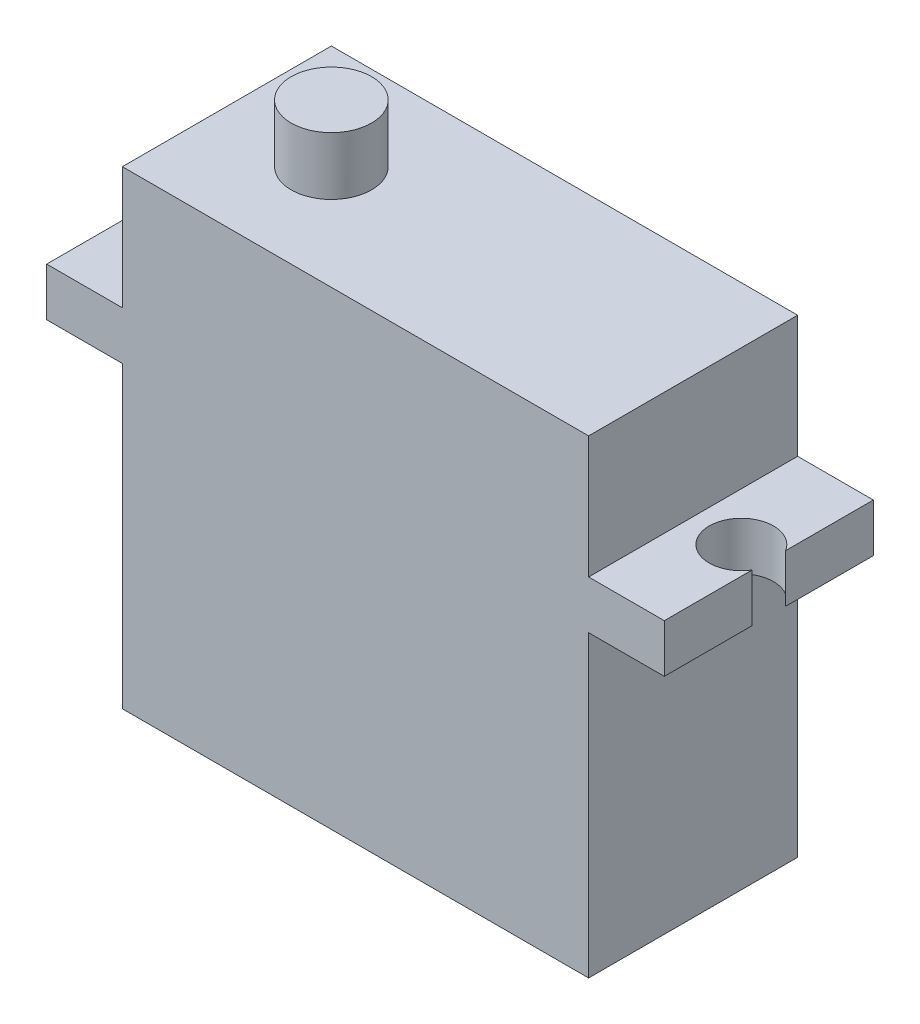
ISO-10303-21;
HEADER;
FILE_DESCRIPTION(('STEP AP214'),'2;1');
FILE_NAME('part.step','',(''),(''),'','','');
FILE_SCHEMA(('AUTOMOTIVE_DESIGN { 1 0 10303 214 1 1 1 1 }'));
ENDSEC;
DATA;
#1=APPLICATION_CONTEXT('core data for automotive mechanical design processes');
#2=APPLICATION_PROTOCOL_DEFINITION('international standard','automotive_design',2000,#1);
#3=PRODUCT_CONTEXT('',#1,'mechanical');
#4=PRODUCT('Part','Part','',(#3));
#5=PRODUCT_RELATED_PRODUCT_CATEGORY('part','',(#4));
#6=PRODUCT_DEFINITION_FORMATION('','',#4);
#7=PRODUCT_DEFINITION_CONTEXT('part definition',#1,'design');
#8=PRODUCT_DEFINITION('design','',#6,#7);
#9=PRODUCT_DEFINITION_SHAPE('','',#8);
#10=(LENGTH_UNIT() NAMED_UNIT(*) SI_UNIT(.MILLI.,.METRE.));
#11=(NAMED_UNIT(*) PLANE_ANGLE_UNIT() SI_UNIT($,.RADIAN.));
#12=(NAMED_UNIT(*) SI_UNIT($,.STERADIAN.) SOLID_ANGLE_UNIT());
#13=UNCERTAINTY_MEASURE_WITH_UNIT(LENGTH_MEASURE(1.E-05),#10,'distance_accuracy_value','');
#14=(GEOMETRIC_REPRESENTATION_CONTEXT(3) GLOBAL_UNCERTAINTY_ASSIGNED_CONTEXT((#13)) GLOBAL_UNIT_ASSIGNED_CONTEXT((#10,
#11,#12)) REPRESENTATION_CONTEXT('',''));
#15=CARTESIAN_POINT('',(0.,0.,0.));
#16=DIRECTION('',(0.,0.,1.));
#17=DIRECTION('',(1.,0.,0.));
#18=AXIS2_PLACEMENT_3D('',#15,#16,#17);
#19=CARTESIAN_POINT('',(29.,29.2,0.));
#20=DIRECTION('',(-1.,0.,0.));
#21=DIRECTION('',(0.,0.,1.));
#22=AXIS2_PLACEMENT_3D('',#19,#20,#21);
#23=PLANE('',#22);
#24=DIRECTION('',(0.,0.,1.));
#25=VECTOR('',#24,1.);
#26=CARTESIAN_POINT('',(29.,21.6,0.));
#27=LINE('',#26,#25);
#28=CARTESIAN_POINT('',(29.,21.6,-13.));
#29=VERTEX_POINT('',#28);
#30=CARTESIAN_POINT('',(29.,21.6,0.));
#31=VERTEX_POINT('',#30);
#32=EDGE_CURVE('E193',#29,#31,#27,.T.);
#33=ORIENTED_EDGE('',*,*,#32,.F.);
#34=DIRECTION('',(0.,-1.,0.));
#35=VECTOR('',#34,1.);
#36=CARTESIAN_POINT('',(29.,29.2,-13.));
#37=LINE('',#36,#35);
#38=CARTESIAN_POINT('',(29.,29.2,-13.));
#39=VERTEX_POINT('',#38);
#40=EDGE_CURVE('E314',#39,#29,#37,.T.);
#41=ORIENTED_EDGE('',*,*,#40,.F.);
#42=DIRECTION('',(0.,0.,-1.));
#43=VECTOR('',#42,1.);
#44=CARTESIAN_POINT('',(29.,29.2,0.));
#45=LINE('',#44,#43);
#46=CARTESIAN_POINT('',(29.,29.2,0.));
#47=VERTEX_POINT('',#46);
#48=EDGE_CURVE('E291',#47,#39,#45,.T.);
#49=ORIENTED_EDGE('',*,*,#48,.F.);
#50=DIRECTION('',(0.,-1.,0.));
#51=VECTOR('',#50,1.);
#52=CARTESIAN_POINT('',(29.,29.2,0.));
#53=LINE('',#52,#51);
#54=EDGE_CURVE('E318',#47,#31,#53,.T.);
#55=ORIENTED_EDGE('',*,*,#54,.T.);
#56=EDGE_LOOP('',(#33,#41,#49,#55));
#57=FACE_BOUND('',#56,.T.);
#58=ADVANCED_FACE('F49',(#57),#23,.F.);
#59=CARTESIAN_POINT('',(0.,29.2,0.));
#60=DIRECTION('',(1.,0.,0.));
#61=DIRECTION('',(0.,0.,-1.));
#62=AXIS2_PLACEMENT_3D('',#59,#60,#61);
#63=PLANE('',#62);
#64=DIRECTION('',(0.,0.,-1.));
#65=VECTOR('',#64,1.);
#66=CARTESIAN_POINT('',(0.,21.6,0.));
#67=LINE('',#66,#65);
#68=CARTESIAN_POINT('',(0.,21.6,0.));
#69=VERTEX_POINT('',#68);
#70=CARTESIAN_POINT('',(0.,21.6,-13.));
#71=VERTEX_POINT('',#70);
#72=EDGE_CURVE('E243',#69,#71,#67,.T.);
#73=ORIENTED_EDGE('',*,*,#72,.F.);
#74=DIRECTION('',(0.,-1.,0.));
#75=VECTOR('',#74,1.);
#76=CARTESIAN_POINT('',(0.,29.2,0.));
#77=LINE('',#76,#75);
#78=CARTESIAN_POINT('',(0.,29.2,0.));
#79=VERTEX_POINT('',#78);
#80=EDGE_CURVE('E58',#79,#69,#77,.T.);
#81=ORIENTED_EDGE('',*,*,#80,.F.);
#82=DIRECTION('',(0.,0.,1.));
#83=VECTOR('',#82,1.);
#84=CARTESIAN_POINT('',(0.,29.2,0.));
#85=LINE('',#84,#83);
#86=CARTESIAN_POINT('',(0.,29.2,-13.));
#87=VERTEX_POINT('',#86);
#88=EDGE_CURVE('E283',#87,#79,#85,.T.);
#89=ORIENTED_EDGE('',*,*,#88,.F.);
#90=DIRECTION('',(0.,-1.,0.));
#91=VECTOR('',#90,1.);
#92=CARTESIAN_POINT('',(0.,29.2,-13.));
#93=LINE('',#92,#91);
#94=EDGE_CURVE('E311',#87,#71,#93,.T.);
#95=ORIENTED_EDGE('',*,*,#94,.T.);
#96=EDGE_LOOP('',(#73,#81,#89,#95));
#97=FACE_BOUND('',#96,.T.);
#98=ADVANCED_FACE('F370',(#97),#63,.F.);
#99=CARTESIAN_POINT('',(0.,18.6,0.));
#100=VERTEX_POINT('',#99);
#101=CARTESIAN_POINT('',(0.,0.,0.));
#102=VERTEX_POINT('',#101);
#103=EDGE_CURVE('E320',#100,#102,#77,.T.);
#104=ORIENTED_EDGE('',*,*,#103,.F.);
#105=DIRECTION('',(0.,0.,-1.));
#106=VECTOR('',#105,1.);
#107=CARTESIAN_POINT('',(0.,18.6,0.));
#108=LINE('',#107,#106);
#109=CARTESIAN_POINT('',(0.,18.6,-13.));
#110=VERTEX_POINT('',#109);
#111=EDGE_CURVE('E260',#100,#110,#108,.T.);
#112=ORIENTED_EDGE('',*,*,#111,.T.);
#113=CARTESIAN_POINT('',(0.,0.,-13.));
#114=VERTEX_POINT('',#113);
#115=EDGE_CURVE('E297',#110,#114,#93,.T.);
#116=ORIENTED_EDGE('',*,*,#115,.T.);
#117=DIRECTION('',(0.,0.,1.));
#118=VECTOR('',#117,1.);
#119=CARTESIAN_POINT('',(0.,0.,0.));
#120=LINE('',#119,#118);
#121=EDGE_CURVE('E271',#114,#102,#120,.T.);
#122=ORIENTED_EDGE('',*,*,#121,.T.);
#123=EDGE_LOOP('',(#104,#112,#116,#122));
#124=FACE_BOUND('',#123,.T.);
#125=ADVANCED_FACE('F51',(#124),#63,.F.);
#126=CARTESIAN_POINT('',(0.,29.2,0.));
#127=DIRECTION('',(0.,0.,-1.));
#128=DIRECTION('',(-1.,0.,0.));
#129=AXIS2_PLACEMENT_3D('',#126,#127,#128);
#130=PLANE('',#129);
#131=DIRECTION('',(1.,0.,0.));
#132=VECTOR('',#131,1.);
#133=CARTESIAN_POINT('',(0.,0.,0.));
#134=LINE('',#133,#132);
#135=CARTESIAN_POINT('',(29.,0.,0.));
#136=VERTEX_POINT('',#135);
#137=EDGE_CURVE('E301',#102,#136,#134,.T.);
#138=ORIENTED_EDGE('',*,*,#137,.T.);
#139=CARTESIAN_POINT('',(29.,18.6,0.));
#140=VERTEX_POINT('',#139);
#141=EDGE_CURVE('E317',#140,#136,#53,.T.);
#142=ORIENTED_EDGE('',*,*,#141,.F.);
#143=DIRECTION('',(1.,0.,0.));
#144=VECTOR('',#143,1.);
#145=CARTESIAN_POINT('',(0.,18.6,0.));
#146=LINE('',#145,#144);
#147=CARTESIAN_POINT('',(33.7064948388361,18.6,0.));
#148=VERTEX_POINT('',#147);
#149=EDGE_CURVE('E213',#140,#148,#146,.T.);
#150=ORIENTED_EDGE('',*,*,#149,.T.);
#151=DIRECTION('',(0.,-1.,0.));
#152=VECTOR('',#151,1.);
#153=CARTESIAN_POINT('',(33.7064948388361,21.6,0.));
#154=LINE('',#153,#152);
#155=CARTESIAN_POINT('',(33.7064948388361,21.6,0.));
#156=VERTEX_POINT('',#155);
#157=EDGE_CURVE('E172',#156,#148,#154,.T.);
#158=ORIENTED_EDGE('',*,*,#157,.F.);
#159=DIRECTION('',(1.,0.,0.));
#160=VECTOR('',#159,1.);
#161=CARTESIAN_POINT('',(0.,21.6,0.));
#162=LINE('',#161,#160);
#163=EDGE_CURVE('E188',#31,#156,#162,.T.);
#164=ORIENTED_EDGE('',*,*,#163,.F.);
#165=ORIENTED_EDGE('',*,*,#54,.F.);
#166=DIRECTION('',(1.,0.,0.));
#167=VECTOR('',#166,1.);
#168=CARTESIAN_POINT('',(0.,29.2,0.));
#169=LINE('',#168,#167);
#170=EDGE_CURVE('E287',#79,#47,#169,.T.);
#171=ORIENTED_EDGE('',*,*,#170,.F.);
#172=ORIENTED_EDGE('',*,*,#80,.T.);
#173=DIRECTION('',(-1.,0.,0.));
#174=VECTOR('',#173,1.);
#175=CARTESIAN_POINT('',(0.,21.6,0.));
#176=LINE('',#175,#174);
#177=CARTESIAN_POINT('',(-4.70649483883612,21.6,0.));
#178=VERTEX_POINT('',#177);
#179=EDGE_CURVE('E247',#69,#178,#176,.T.);
#180=ORIENTED_EDGE('',*,*,#179,.T.);
#181=DIRECTION('',(0.,-1.,0.));
#182=VECTOR('',#181,1.);
#183=CARTESIAN_POINT('',(-4.70649483883612,21.6,0.));
#184=LINE('',#183,#182);
#185=CARTESIAN_POINT('',(-4.70649483883612,18.6,0.));
#186=VERTEX_POINT('',#185);
#187=EDGE_CURVE('E272',#178,#186,#184,.T.);
#188=ORIENTED_EDGE('',*,*,#187,.T.);
#189=DIRECTION('',(-1.,0.,0.));
#190=VECTOR('',#189,1.);
#191=CARTESIAN_POINT('',(0.,18.6,0.));
#192=LINE('',#191,#190);
#193=EDGE_CURVE('E263',#100,#186,#192,.T.);
#194=ORIENTED_EDGE('',*,*,#193,.F.);
#195=ORIENTED_EDGE('',*,*,#103,.T.);
#196=EDGE_LOOP('',(#138,#142,#150,#158,#164,#165,#171,#172,#180,#188,#194,#195));
#197=FACE_BOUND('',#196,.T.);
#198=ADVANCED_FACE('F329',(#197),#130,.F.);
#199=CARTESIAN_POINT('',(29.,18.6,-13.));
#200=VERTEX_POINT('',#199);
#201=CARTESIAN_POINT('',(29.,0.,-13.));
#202=VERTEX_POINT('',#201);
#203=EDGE_CURVE('E70',#200,#202,#37,.T.);
#204=ORIENTED_EDGE('',*,*,#203,.F.);
#205=DIRECTION('',(0.,0.,1.));
#206=VECTOR('',#205,1.);
#207=CARTESIAN_POINT('',(29.,18.6,0.));
#208=LINE('',#207,#206);
#209=EDGE_CURVE('E65',#200,#140,#208,.T.);
#210=ORIENTED_EDGE('',*,*,#209,.T.);
#211=ORIENTED_EDGE('',*,*,#141,.T.);
#212=DIRECTION('',(0.,0.,-1.));
#213=VECTOR('',#212,1.);
#214=CARTESIAN_POINT('',(29.,0.,0.));
#215=LINE('',#214,#213);
#216=EDGE_CURVE('E305',#136,#202,#215,.T.);
#217=ORIENTED_EDGE('',*,*,#216,.T.);
#218=EDGE_LOOP('',(#204,#210,#211,#217));
#219=FACE_BOUND('',#218,.T.);
#220=ADVANCED_FACE('F343',(#219),#23,.F.);
#221=CARTESIAN_POINT('',(0.,29.2,-13.));
#222=DIRECTION('',(0.,0.,1.));
#223=DIRECTION('',(1.,0.,0.));
#224=AXIS2_PLACEMENT_3D('',#221,#222,#223);
#225=PLANE('',#224);
#226=DIRECTION('',(-1.,0.,0.));
#227=VECTOR('',#226,1.);
#228=CARTESIAN_POINT('',(0.,0.,-13.));
#229=LINE('',#228,#227);
#230=EDGE_CURVE('E288',#202,#114,#229,.T.);
#231=ORIENTED_EDGE('',*,*,#230,.T.);
#232=ORIENTED_EDGE('',*,*,#115,.F.);
#233=DIRECTION('',(-1.,0.,0.));
#234=VECTOR('',#233,1.);
#235=CARTESIAN_POINT('',(-1.24580299130882E-13,18.6,-13.));
#236=LINE('',#235,#234);
#237=CARTESIAN_POINT('',(-4.70649483883614,18.6,-13.));
#238=VERTEX_POINT('',#237);
#239=EDGE_CURVE('E257',#110,#238,#236,.T.);
#240=ORIENTED_EDGE('',*,*,#239,.T.);
#241=DIRECTION('',(0.,-1.,0.));
#242=VECTOR('',#241,1.);
#243=CARTESIAN_POINT('',(-4.70649483883614,21.6,-13.));
#244=LINE('',#243,#242);
#245=CARTESIAN_POINT('',(-4.70649483883614,21.6,-13.));
#246=VERTEX_POINT('',#245);
#247=EDGE_CURVE('E275',#246,#238,#244,.T.);
#248=ORIENTED_EDGE('',*,*,#247,.F.);
#249=DIRECTION('',(-1.,0.,0.));
#250=VECTOR('',#249,1.);
#251=CARTESIAN_POINT('',(-1.24580299130882E-13,21.6,-13.));
#252=LINE('',#251,#250);
#253=EDGE_CURVE('E239',#71,#246,#252,.T.);
#254=ORIENTED_EDGE('',*,*,#253,.F.);
#255=ORIENTED_EDGE('',*,*,#94,.F.);
#256=DIRECTION('',(-1.,0.,0.));
#257=VECTOR('',#256,1.);
#258=CARTESIAN_POINT('',(0.,29.2,-13.));
#259=LINE('',#258,#257);
#260=EDGE_CURVE('E294',#39,#87,#259,.T.);
#261=ORIENTED_EDGE('',*,*,#260,.F.);
#262=ORIENTED_EDGE('',*,*,#40,.T.);
#263=DIRECTION('',(1.,0.,0.));
#264=VECTOR('',#263,1.);
#265=CARTESIAN_POINT('',(0.,21.6,-13.));
#266=LINE('',#265,#264);
#267=CARTESIAN_POINT('',(33.7064948388361,21.6,-13.));
#268=VERTEX_POINT('',#267);
#269=EDGE_CURVE('E196',#29,#268,#266,.T.);
#270=ORIENTED_EDGE('',*,*,#269,.T.);
#271=DIRECTION('',(0.,-1.,0.));
#272=VECTOR('',#271,1.);
#273=CARTESIAN_POINT('',(33.7064948388361,21.6,-13.));
#274=LINE('',#273,#272);
#275=CARTESIAN_POINT('',(33.7064948388361,18.6,-13.));
#276=VERTEX_POINT('',#275);
#277=EDGE_CURVE('E226',#268,#276,#274,.T.);
#278=ORIENTED_EDGE('',*,*,#277,.T.);
#279=DIRECTION('',(1.,0.,0.));
#280=VECTOR('',#279,1.);
#281=CARTESIAN_POINT('',(0.,18.6,-13.));
#282=LINE('',#281,#280);
#283=EDGE_CURVE('E219',#200,#276,#282,.T.);
#284=ORIENTED_EDGE('',*,*,#283,.F.);
#285=ORIENTED_EDGE('',*,*,#203,.T.);
#286=EDGE_LOOP('',(#231,#232,#240,#248,#254,#255,#261,#262,#270,#278,#284,#285));
#287=FACE_BOUND('',#286,.T.);
#288=ADVANCED_FACE('F340',(#287),#225,.F.);
#289=CARTESIAN_POINT('',(0.,29.2,0.));
#290=DIRECTION('',(0.,-1.,0.));
#291=DIRECTION('',(0.,0.,-1.));
#292=AXIS2_PLACEMENT_3D('',#289,#290,#291);
#293=PLANE('',#292);
#294=CARTESIAN_POINT('',(6.5,29.2,-6.5));
#295=DIRECTION('',(0.,-1.,0.));
#296=DIRECTION('',(0.,0.,-1.));
#297=AXIS2_PLACEMENT_3D('',#294,#295,#296);
#298=CIRCLE('',#297,2.5);
#299=CARTESIAN_POINT('',(6.5,29.2,-9.));
#300=VERTEX_POINT('',#299);
#301=EDGE_CURVE('E11',#300,#300,#298,.F.);
#302=ORIENTED_EDGE('',*,*,#301,.F.);
#303=EDGE_LOOP('',(#302));
#304=FACE_BOUND('',#303,.T.);
#305=ORIENTED_EDGE('',*,*,#88,.T.);
#306=ORIENTED_EDGE('',*,*,#170,.T.);
#307=ORIENTED_EDGE('',*,*,#48,.T.);
#308=ORIENTED_EDGE('',*,*,#260,.T.);
#309=EDGE_LOOP('',(#305,#306,#307,#308));
#310=FACE_BOUND('',#309,.T.);
#311=ADVANCED_FACE('F372',(#304,#310),#293,.F.);
#312=CARTESIAN_POINT('',(0.,0.,0.));
#313=DIRECTION('',(0.,-1.,0.));
#314=DIRECTION('',(0.,0.,-1.));
#315=AXIS2_PLACEMENT_3D('',#312,#313,#314);
#316=PLANE('',#315);
#317=ORIENTED_EDGE('',*,*,#121,.F.);
#318=ORIENTED_EDGE('',*,*,#230,.F.);
#319=ORIENTED_EDGE('',*,*,#216,.F.);
#320=ORIENTED_EDGE('',*,*,#137,.F.);
#321=EDGE_LOOP('',(#317,#318,#319,#320));
#322=FACE_BOUND('',#321,.T.);
#323=ADVANCED_FACE('F335',(#322),#316,.T.);
#324=CARTESIAN_POINT('',(-3.,21.6,-6.5));
#325=DIRECTION('',(0.,-1.,0.));
#326=DIRECTION('',(0.,0.,-1.));
#327=AXIS2_PLACEMENT_3D('',#324,#325,#326);
#328=CYLINDRICAL_SURFACE('',#327,2.);
#329=CARTESIAN_POINT('',(-3.,18.6,-6.5));
#330=DIRECTION('',(0.,-1.,0.));
#331=DIRECTION('',(0.,0.,-1.));
#332=AXIS2_PLACEMENT_3D('',#329,#330,#331);
#333=CIRCLE('',#332,2.);
#334=CARTESIAN_POINT('',(-4.70649483883613,18.6,-7.54301263895776));
#335=VERTEX_POINT('',#334);
#336=CARTESIAN_POINT('',(-4.70649483883613,18.6,-5.45698736104223));
#337=VERTEX_POINT('',#336);
#338=EDGE_CURVE('E225',#335,#337,#333,.T.);
#339=ORIENTED_EDGE('',*,*,#338,.T.);
#340=DIRECTION('',(0.,-1.,0.));
#341=VECTOR('',#340,1.);
#342=CARTESIAN_POINT('',(-4.70649483883613,21.6,-5.45698736104223));
#343=LINE('',#342,#341);
#344=CARTESIAN_POINT('',(-4.70649483883613,21.6,-5.45698736104223));
#345=VERTEX_POINT('',#344);
#346=EDGE_CURVE('E267',#345,#337,#343,.T.);
#347=ORIENTED_EDGE('',*,*,#346,.F.);
#348=CARTESIAN_POINT('',(-3.,21.6,-6.5));
#349=DIRECTION('',(0.,-1.,0.));
#350=DIRECTION('',(0.,0.,-1.));
#351=AXIS2_PLACEMENT_3D('',#348,#349,#350);
#352=CIRCLE('',#351,2.);
#353=CARTESIAN_POINT('',(-4.70649483883613,21.6,-7.54301263895776));
#354=VERTEX_POINT('',#353);
#355=EDGE_CURVE('E231',#354,#345,#352,.T.);
#356=ORIENTED_EDGE('',*,*,#355,.F.);
#357=DIRECTION('',(0.,-1.,0.));
#358=VECTOR('',#357,1.);
#359=CARTESIAN_POINT('',(-4.70649483883613,21.6,-7.54301263895776));
#360=LINE('',#359,#358);
#361=EDGE_CURVE('E279',#354,#335,#360,.T.);
#362=ORIENTED_EDGE('',*,*,#361,.T.);
#363=EDGE_LOOP('',(#339,#347,#356,#362));
#364=FACE_BOUND('',#363,.T.);
#365=ADVANCED_FACE('F401',(#364),#328,.F.);
#366=CARTESIAN_POINT('',(-4.70649483883612,21.6,0.));
#367=DIRECTION('',(1.,0.,0.));
#368=DIRECTION('',(0.,0.,-1.));
#369=AXIS2_PLACEMENT_3D('',#366,#367,#368);
#370=PLANE('',#369);
#371=DIRECTION('',(0.,0.,1.));
#372=VECTOR('',#371,1.);
#373=CARTESIAN_POINT('',(-4.70649483883612,18.6,0.));
#374=LINE('',#373,#372);
#375=EDGE_CURVE('E236',#337,#186,#374,.T.);
#376=ORIENTED_EDGE('',*,*,#375,.T.);
#377=ORIENTED_EDGE('',*,*,#187,.F.);
#378=DIRECTION('',(0.,0.,1.));
#379=VECTOR('',#378,1.);
#380=CARTESIAN_POINT('',(-4.70649483883612,21.6,0.));
#381=LINE('',#380,#379);
#382=EDGE_CURVE('E240',#345,#178,#381,.T.);
#383=ORIENTED_EDGE('',*,*,#382,.F.);
#384=ORIENTED_EDGE('',*,*,#346,.T.);
#385=EDGE_LOOP('',(#376,#377,#383,#384));
#386=FACE_BOUND('',#385,.T.);
#387=ADVANCED_FACE('F351',(#386),#370,.F.);
#388=EDGE_CURVE('E254',#238,#335,#374,.T.);
#389=ORIENTED_EDGE('',*,*,#388,.T.);
#390=ORIENTED_EDGE('',*,*,#361,.F.);
#391=EDGE_CURVE('E235',#246,#354,#381,.T.);
#392=ORIENTED_EDGE('',*,*,#391,.F.);
#393=ORIENTED_EDGE('',*,*,#247,.T.);
#394=EDGE_LOOP('',(#389,#390,#392,#393));
#395=FACE_BOUND('',#394,.T.);
#396=ADVANCED_FACE('F361',(#395),#370,.F.);
#397=CARTESIAN_POINT('',(0.,21.6,0.));
#398=DIRECTION('',(0.,-1.,0.));
#399=DIRECTION('',(0.,0.,-1.));
#400=AXIS2_PLACEMENT_3D('',#397,#398,#399);
#401=PLANE('',#400);
#402=ORIENTED_EDGE('',*,*,#355,.T.);
#403=ORIENTED_EDGE('',*,*,#382,.T.);
#404=ORIENTED_EDGE('',*,*,#179,.F.);
#405=ORIENTED_EDGE('',*,*,#72,.T.);
#406=ORIENTED_EDGE('',*,*,#253,.T.);
#407=ORIENTED_EDGE('',*,*,#391,.T.);
#408=EDGE_LOOP('',(#402,#403,#404,#405,#406,#407));
#409=FACE_BOUND('',#408,.T.);
#410=ADVANCED_FACE('F365',(#409),#401,.F.);
#411=CARTESIAN_POINT('',(0.,18.6,0.));
#412=DIRECTION('',(0.,-1.,0.));
#413=DIRECTION('',(0.,0.,-1.));
#414=AXIS2_PLACEMENT_3D('',#411,#412,#413);
#415=PLANE('',#414);
#416=ORIENTED_EDGE('',*,*,#338,.F.);
#417=ORIENTED_EDGE('',*,*,#388,.F.);
#418=ORIENTED_EDGE('',*,*,#239,.F.);
#419=ORIENTED_EDGE('',*,*,#111,.F.);
#420=ORIENTED_EDGE('',*,*,#193,.T.);
#421=ORIENTED_EDGE('',*,*,#375,.F.);
#422=EDGE_LOOP('',(#416,#417,#418,#419,#420,#421));
#423=FACE_BOUND('',#422,.T.);
#424=ADVANCED_FACE('F355',(#423),#415,.T.);
#425=CARTESIAN_POINT('',(32.,21.6,-6.5));
#426=DIRECTION('',(0.,-1.,0.));
#427=DIRECTION('',(0.,0.,-1.));
#428=AXIS2_PLACEMENT_3D('',#425,#426,#427);
#429=CYLINDRICAL_SURFACE('',#428,2.);
#430=CARTESIAN_POINT('',(32.,18.6,-6.5));
#431=DIRECTION('',(0.,-1.,0.));
#432=DIRECTION('',(0.,0.,-1.));
#433=AXIS2_PLACEMENT_3D('',#430,#431,#432);
#434=CIRCLE('',#433,2.);
#435=CARTESIAN_POINT('',(33.7064948388361,18.6,-5.45698736104224));
#436=VERTEX_POINT('',#435);
#437=CARTESIAN_POINT('',(33.7064948388361,18.6,-7.54301263895776));
#438=VERTEX_POINT('',#437);
#439=EDGE_CURVE('E207',#436,#438,#434,.T.);
#440=ORIENTED_EDGE('',*,*,#439,.T.);
#441=DIRECTION('',(0.,-1.,0.));
#442=VECTOR('',#441,1.);
#443=CARTESIAN_POINT('',(33.7064948388361,21.6,-7.54301263895776));
#444=LINE('',#443,#442);
#445=CARTESIAN_POINT('',(33.7064948388361,21.6,-7.54301263895776));
#446=VERTEX_POINT('',#445);
#447=EDGE_CURVE('E178',#446,#438,#444,.T.);
#448=ORIENTED_EDGE('',*,*,#447,.F.);
#449=CARTESIAN_POINT('',(32.,21.6,-6.5));
#450=DIRECTION('',(0.,-1.,0.));
#451=DIRECTION('',(0.,0.,-1.));
#452=AXIS2_PLACEMENT_3D('',#449,#450,#451);
#453=CIRCLE('',#452,2.);
#454=CARTESIAN_POINT('',(33.7064948388361,21.6,-5.45698736104224));
#455=VERTEX_POINT('',#454);
#456=EDGE_CURVE('E176',#455,#446,#453,.T.);
#457=ORIENTED_EDGE('',*,*,#456,.F.);
#458=DIRECTION('',(0.,-1.,0.));
#459=VECTOR('',#458,1.);
#460=CARTESIAN_POINT('',(33.7064948388361,21.6,-5.45698736104224));
#461=LINE('',#460,#459);
#462=EDGE_CURVE('E161',#455,#436,#461,.T.);
#463=ORIENTED_EDGE('',*,*,#462,.T.);
#464=EDGE_LOOP('',(#440,#448,#457,#463));
#465=FACE_BOUND('',#464,.T.);
#466=ADVANCED_FACE('F177',(#465),#429,.F.);
#467=CARTESIAN_POINT('',(33.7064948388361,21.6,0.));
#468=DIRECTION('',(1.,0.,0.));
#469=DIRECTION('',(0.,0.,-1.));
#470=AXIS2_PLACEMENT_3D('',#467,#468,#469);
#471=PLANE('',#470);
#472=DIRECTION('',(0.,0.,1.));
#473=VECTOR('',#472,1.);
#474=CARTESIAN_POINT('',(33.7064948388361,18.6,0.));
#475=LINE('',#474,#473);
#476=EDGE_CURVE('E183',#276,#438,#475,.T.);
#477=ORIENTED_EDGE('',*,*,#476,.F.);
#478=ORIENTED_EDGE('',*,*,#277,.F.);
#479=DIRECTION('',(0.,0.,1.));
#480=VECTOR('',#479,1.);
#481=CARTESIAN_POINT('',(33.7064948388361,21.6,0.));
#482=LINE('',#481,#480);
#483=EDGE_CURVE('E173',#268,#446,#482,.T.);
#484=ORIENTED_EDGE('',*,*,#483,.T.);
#485=ORIENTED_EDGE('',*,*,#447,.T.);
#486=EDGE_LOOP('',(#477,#478,#484,#485));
#487=FACE_BOUND('',#486,.T.);
#488=ADVANCED_FACE('F479',(#487),#471,.T.);
#489=EDGE_CURVE('E167',#436,#148,#475,.T.);
#490=ORIENTED_EDGE('',*,*,#489,.F.);
#491=ORIENTED_EDGE('',*,*,#462,.F.);
#492=EDGE_CURVE('E165',#455,#156,#482,.T.);
#493=ORIENTED_EDGE('',*,*,#492,.T.);
#494=ORIENTED_EDGE('',*,*,#157,.T.);
#495=EDGE_LOOP('',(#490,#491,#493,#494));
#496=FACE_BOUND('',#495,.T.);
#497=ADVANCED_FACE('F163',(#496),#471,.T.);
#498=CARTESIAN_POINT('',(0.,21.6,0.));
#499=DIRECTION('',(0.,-1.,0.));
#500=DIRECTION('',(0.,0.,-1.));
#501=AXIS2_PLACEMENT_3D('',#498,#499,#500);
#502=PLANE('',#501);
#503=ORIENTED_EDGE('',*,*,#456,.T.);
#504=ORIENTED_EDGE('',*,*,#483,.F.);
#505=ORIENTED_EDGE('',*,*,#269,.F.);
#506=ORIENTED_EDGE('',*,*,#32,.T.);
#507=ORIENTED_EDGE('',*,*,#163,.T.);
#508=ORIENTED_EDGE('',*,*,#492,.F.);
#509=EDGE_LOOP('',(#503,#504,#505,#506,#507,#508));
#510=FACE_BOUND('',#509,.T.);
#511=ADVANCED_FACE('F185',(#510),#502,.F.);
#512=CARTESIAN_POINT('',(0.,18.6,0.));
#513=DIRECTION('',(0.,-1.,0.));
#514=DIRECTION('',(0.,0.,-1.));
#515=AXIS2_PLACEMENT_3D('',#512,#513,#514);
#516=PLANE('',#515);
#517=ORIENTED_EDGE('',*,*,#439,.F.);
#518=ORIENTED_EDGE('',*,*,#489,.T.);
#519=ORIENTED_EDGE('',*,*,#149,.F.);
#520=ORIENTED_EDGE('',*,*,#209,.F.);
#521=ORIENTED_EDGE('',*,*,#283,.T.);
#522=ORIENTED_EDGE('',*,*,#476,.T.);
#523=EDGE_LOOP('',(#517,#518,#519,#520,#521,#522));
#524=FACE_BOUND('',#523,.T.);
#525=ADVANCED_FACE('F378',(#524),#516,.T.);
#526=CARTESIAN_POINT('',(6.5,32.8,-6.5));
#527=DIRECTION('',(0.,-1.,0.));
#528=DIRECTION('',(0.,0.,-1.));
#529=AXIS2_PLACEMENT_3D('',#526,#527,#528);
#530=CYLINDRICAL_SURFACE('',#529,2.5);
#531=CARTESIAN_POINT('',(6.5,32.8,-6.5));
#532=DIRECTION('',(0.,1.,0.));
#533=DIRECTION('',(0.,0.,1.));
#534=AXIS2_PLACEMENT_3D('',#531,#532,#533);
#535=CIRCLE('',#534,2.5);
#536=CARTESIAN_POINT('',(6.5,32.8,-4.));
#537=VERTEX_POINT('',#536);
#538=EDGE_CURVE('E210',#537,#537,#535,.T.);
#539=ORIENTED_EDGE('',*,*,#538,.F.);
#540=EDGE_LOOP('',(#539));
#541=FACE_BOUND('',#540,.T.);
#542=ORIENTED_EDGE('',*,*,#301,.T.);
#543=EDGE_LOOP('',(#542));
#544=FACE_BOUND('',#543,.T.);
#545=ADVANCED_FACE('F389',(#541,#544),#530,.T.);
#546=CARTESIAN_POINT('',(0.,32.8,0.));
#547=DIRECTION('',(0.,1.,0.));
#548=DIRECTION('',(0.,0.,1.));
#549=AXIS2_PLACEMENT_3D('',#546,#547,#548);
#550=PLANE('',#549);
#551=ORIENTED_EDGE('',*,*,#538,.T.);
#552=EDGE_LOOP('',(#551));
#553=FACE_BOUND('',#552,.T.);
#554=ADVANCED_FACE('F387',(#553),#550,.T.);
#555=CLOSED_SHELL('',(#58,#98,#125,#198,#220,#288,#311,#323,#365,#387,#396,#410,#424,#466,#488,
#497,#511,#525,#545,#554));
#556=MANIFOLD_SOLID_BREP('B2',#555);
#557=ADVANCED_BREP_SHAPE_REPRESENTATION('',(#18,#556),#14);
#558=SHAPE_DEFINITION_REPRESENTATION(#9,#557);
ENDSEC;
END-ISO-10303-21;
